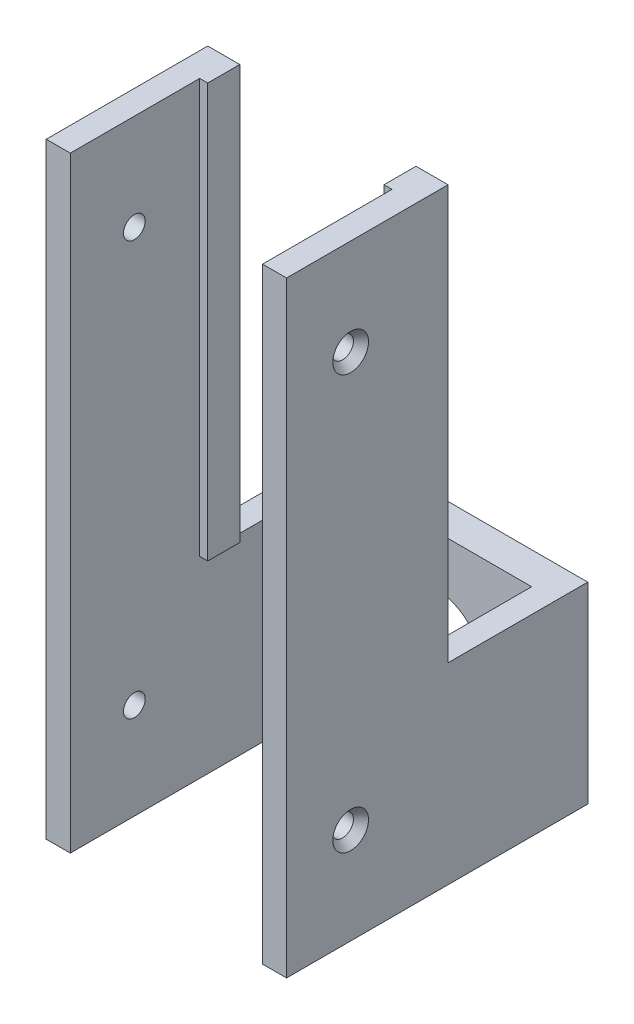
ISO-10303-21;
HEADER;
FILE_DESCRIPTION(('STEP AP214'),'2;1');
FILE_NAME('part.step','',(''),(''),'','','');
FILE_SCHEMA(('AUTOMOTIVE_DESIGN { 1 0 10303 214 1 1 1 1 }'));
ENDSEC;
DATA;
#1=APPLICATION_CONTEXT('core data for automotive mechanical design processes');
#2=APPLICATION_PROTOCOL_DEFINITION('international standard','automotive_design',2000,#1);
#3=PRODUCT_CONTEXT('',#1,'mechanical');
#4=PRODUCT('Part','Part','',(#3));
#5=PRODUCT_RELATED_PRODUCT_CATEGORY('part','',(#4));
#6=PRODUCT_DEFINITION_FORMATION('','',#4);
#7=PRODUCT_DEFINITION_CONTEXT('part definition',#1,'design');
#8=PRODUCT_DEFINITION('design','',#6,#7);
#9=PRODUCT_DEFINITION_SHAPE('','',#8);
#10=(LENGTH_UNIT() NAMED_UNIT(*) SI_UNIT(.MILLI.,.METRE.));
#11=(NAMED_UNIT(*) PLANE_ANGLE_UNIT() SI_UNIT($,.RADIAN.));
#12=(NAMED_UNIT(*) SI_UNIT($,.STERADIAN.) SOLID_ANGLE_UNIT());
#13=UNCERTAINTY_MEASURE_WITH_UNIT(LENGTH_MEASURE(1.E-05),#10,'distance_accuracy_value','');
#14=(GEOMETRIC_REPRESENTATION_CONTEXT(3) GLOBAL_UNCERTAINTY_ASSIGNED_CONTEXT((#13)) GLOBAL_UNIT_ASSIGNED_CONTEXT((#10,
#11,#12)) REPRESENTATION_CONTEXT('',''));
#15=CARTESIAN_POINT('',(0.,0.,0.));
#16=DIRECTION('',(0.,0.,1.));
#17=DIRECTION('',(1.,0.,0.));
#18=AXIS2_PLACEMENT_3D('',#15,#16,#17);
#19=CARTESIAN_POINT('',(0.,38.1,0.));
#20=DIRECTION('',(0.,-1.,0.));
#21=DIRECTION('',(0.,0.,-1.));
#22=AXIS2_PLACEMENT_3D('',#19,#20,#21);
#23=PLANE('',#22);
#24=DIRECTION('',(0.,0.,1.));
#25=VECTOR('',#24,1.);
#26=CARTESIAN_POINT('',(42.8625,38.1,0.));
#27=LINE('',#26,#25);
#28=CARTESIAN_POINT('',(42.8625,38.1,-53.34));
#29=VERTEX_POINT('',#28);
#30=CARTESIAN_POINT('',(42.8625,38.1,-32.004));
#31=VERTEX_POINT('',#30);
#32=EDGE_CURVE('E346',#29,#31,#27,.T.);
#33=ORIENTED_EDGE('',*,*,#32,.T.);
#34=DIRECTION('',(-1.,0.,0.));
#35=VECTOR('',#34,1.);
#36=CARTESIAN_POINT('',(47.625,38.1,-32.004));
#37=LINE('',#36,#35);
#38=CARTESIAN_POINT('',(47.625,38.1,-32.004));
#39=VERTEX_POINT('',#38);
#40=EDGE_CURVE('E205',#39,#31,#37,.T.);
#41=ORIENTED_EDGE('',*,*,#40,.F.);
#42=DIRECTION('',(0.,0.,-1.));
#43=VECTOR('',#42,1.);
#44=CARTESIAN_POINT('',(47.625,38.1,-59.69));
#45=LINE('',#44,#43);
#46=CARTESIAN_POINT('',(47.625,38.1,-59.69));
#47=VERTEX_POINT('',#46);
#48=EDGE_CURVE('E350',#39,#47,#45,.T.);
#49=ORIENTED_EDGE('',*,*,#48,.T.);
#50=DIRECTION('',(-1.,0.,0.));
#51=VECTOR('',#50,1.);
#52=CARTESIAN_POINT('',(0.,38.1,-59.69));
#53=LINE('',#52,#51);
#54=CARTESIAN_POINT('',(0.,38.1,-59.69));
#55=VERTEX_POINT('',#54);
#56=EDGE_CURVE('E61',#47,#55,#53,.T.);
#57=ORIENTED_EDGE('',*,*,#56,.T.);
#58=DIRECTION('',(0.,0.,1.));
#59=VECTOR('',#58,1.);
#60=CARTESIAN_POINT('',(0.,38.1,0.));
#61=LINE('',#60,#59);
#62=CARTESIAN_POINT('',(0.,38.1,-32.004));
#63=VERTEX_POINT('',#62);
#64=EDGE_CURVE('E355',#55,#63,#61,.T.);
#65=ORIENTED_EDGE('',*,*,#64,.T.);
#66=DIRECTION('',(-1.,0.,0.));
#67=VECTOR('',#66,1.);
#68=CARTESIAN_POINT('',(0.,38.1,-32.004));
#69=LINE('',#68,#67);
#70=CARTESIAN_POINT('',(4.7625,38.1,-32.004));
#71=VERTEX_POINT('',#70);
#72=EDGE_CURVE('E235',#71,#63,#69,.T.);
#73=ORIENTED_EDGE('',*,*,#72,.F.);
#74=DIRECTION('',(0.,0.,-1.));
#75=VECTOR('',#74,1.);
#76=CARTESIAN_POINT('',(4.76249999999999,38.1,-53.34));
#77=LINE('',#76,#75);
#78=CARTESIAN_POINT('',(4.76249999999999,38.1,-53.34));
#79=VERTEX_POINT('',#78);
#80=EDGE_CURVE('E104',#71,#79,#77,.T.);
#81=ORIENTED_EDGE('',*,*,#80,.T.);
#82=DIRECTION('',(1.,0.,0.));
#83=VECTOR('',#82,1.);
#84=CARTESIAN_POINT('',(42.8625,38.1,-53.34));
#85=LINE('',#84,#83);
#86=EDGE_CURVE('E343',#79,#29,#85,.T.);
#87=ORIENTED_EDGE('',*,*,#86,.T.);
#88=EDGE_LOOP('',(#33,#41,#49,#57,#65,#73,#81,#87));
#89=FACE_BOUND('',#88,.T.);
#90=ADVANCED_FACE('F43',(#89),#23,.F.);
#91=CARTESIAN_POINT('',(0.,38.1,0.));
#92=DIRECTION('',(1.,0.,0.));
#93=DIRECTION('',(0.,0.,-1.));
#94=AXIS2_PLACEMENT_3D('',#91,#92,#93);
#95=PLANE('',#94);
#96=DIRECTION('',(0.,0.,1.));
#97=VECTOR('',#96,1.);
#98=CARTESIAN_POINT('',(0.,0.,0.));
#99=LINE('',#98,#97);
#100=CARTESIAN_POINT('',(0.,0.,-59.69));
#101=VERTEX_POINT('',#100);
#102=CARTESIAN_POINT('',(0.,0.,0.));
#103=VERTEX_POINT('',#102);
#104=EDGE_CURVE('E97',#101,#103,#99,.T.);
#105=ORIENTED_EDGE('',*,*,#104,.T.);
#106=DIRECTION('',(0.,-1.,0.));
#107=VECTOR('',#106,1.);
#108=CARTESIAN_POINT('',(0.,38.1,0.));
#109=LINE('',#108,#107);
#110=CARTESIAN_POINT('',(0.,120.142,0.));
#111=VERTEX_POINT('',#110);
#112=EDGE_CURVE('E358',#111,#103,#109,.T.);
#113=ORIENTED_EDGE('',*,*,#112,.F.);
#114=DIRECTION('',(0.,0.,1.));
#115=VECTOR('',#114,1.);
#116=CARTESIAN_POINT('',(0.,120.142,-25.654));
#117=LINE('',#116,#115);
#118=CARTESIAN_POINT('',(0.,120.142,-32.004));
#119=VERTEX_POINT('',#118);
#120=EDGE_CURVE('E316',#119,#111,#117,.T.);
#121=ORIENTED_EDGE('',*,*,#120,.F.);
#122=DIRECTION('',(0.,1.,0.));
#123=VECTOR('',#122,1.);
#124=CARTESIAN_POINT('',(0.,120.142,-32.004));
#125=LINE('',#124,#123);
#126=EDGE_CURVE('E224',#63,#119,#125,.T.);
#127=ORIENTED_EDGE('',*,*,#126,.F.);
#128=ORIENTED_EDGE('',*,*,#64,.F.);
#129=DIRECTION('',(0.,-1.,0.));
#130=VECTOR('',#129,1.);
#131=CARTESIAN_POINT('',(0.,38.1,-59.69));
#132=LINE('',#131,#130);
#133=EDGE_CURVE('E383',#55,#101,#132,.T.);
#134=ORIENTED_EDGE('',*,*,#133,.T.);
#135=EDGE_LOOP('',(#105,#113,#121,#127,#128,#134));
#136=FACE_BOUND('',#135,.T.);
#137=CARTESIAN_POINT('',(0.,101.092,-12.7));
#138=DIRECTION('',(-1.,0.,0.));
#139=DIRECTION('',(0.,0.,1.));
#140=AXIS2_PLACEMENT_3D('',#137,#138,#139);
#141=CIRCLE('',#140,3.5433);
#142=CARTESIAN_POINT('',(0.,101.092,-9.1567));
#143=VERTEX_POINT('',#142);
#144=EDGE_CURVE('E292',#143,#143,#141,.T.);
#145=ORIENTED_EDGE('',*,*,#144,.F.);
#146=EDGE_LOOP('',(#145));
#147=FACE_BOUND('',#146,.T.);
#148=CARTESIAN_POINT('',(0.,19.05,-12.7));
#149=DIRECTION('',(-1.,0.,0.));
#150=DIRECTION('',(0.,0.,1.));
#151=AXIS2_PLACEMENT_3D('',#148,#149,#150);
#152=CIRCLE('',#151,3.5433);
#153=CARTESIAN_POINT('',(0.,19.05,-9.1567));
#154=VERTEX_POINT('',#153);
#155=EDGE_CURVE('E280',#154,#154,#152,.T.);
#156=ORIENTED_EDGE('',*,*,#155,.F.);
#157=EDGE_LOOP('',(#156));
#158=FACE_BOUND('',#157,.T.);
#159=ADVANCED_FACE('F434',(#136,#147,#158),#95,.F.);
#160=CARTESIAN_POINT('',(4.7625,38.1,0.));
#161=DIRECTION('',(0.,0.,-1.));
#162=DIRECTION('',(-1.,0.,0.));
#163=AXIS2_PLACEMENT_3D('',#160,#161,#162);
#164=PLANE('',#163);
#165=DIRECTION('',(1.,0.,0.));
#166=VECTOR('',#165,1.);
#167=CARTESIAN_POINT('',(4.7625,0.,0.));
#168=LINE('',#167,#166);
#169=CARTESIAN_POINT('',(4.7625,0.,0.));
#170=VERTEX_POINT('',#169);
#171=EDGE_CURVE('E339',#103,#170,#168,.T.);
#172=ORIENTED_EDGE('',*,*,#171,.T.);
#173=DIRECTION('',(0.,-1.,0.));
#174=VECTOR('',#173,1.);
#175=CARTESIAN_POINT('',(4.7625,38.1,0.));
#176=LINE('',#175,#174);
#177=CARTESIAN_POINT('',(4.7625,120.142,0.));
#178=VERTEX_POINT('',#177);
#179=EDGE_CURVE('E11',#178,#170,#176,.T.);
#180=ORIENTED_EDGE('',*,*,#179,.F.);
#181=DIRECTION('',(1.,0.,0.));
#182=VECTOR('',#181,1.);
#183=CARTESIAN_POINT('',(0.,120.142,0.));
#184=LINE('',#183,#182);
#185=EDGE_CURVE('E320',#111,#178,#184,.T.);
#186=ORIENTED_EDGE('',*,*,#185,.F.);
#187=ORIENTED_EDGE('',*,*,#112,.T.);
#188=EDGE_LOOP('',(#172,#180,#186,#187));
#189=FACE_BOUND('',#188,.T.);
#190=ADVANCED_FACE('F45',(#189),#164,.F.);
#191=CARTESIAN_POINT('',(4.76249999999999,38.1,-53.34));
#192=DIRECTION('',(-1.,0.,0.));
#193=DIRECTION('',(0.,0.,1.));
#194=AXIS2_PLACEMENT_3D('',#191,#192,#193);
#195=PLANE('',#194);
#196=CARTESIAN_POINT('',(4.7625,19.05,-12.7));
#197=DIRECTION('',(-1.,0.,0.));
#198=DIRECTION('',(0.,0.,1.));
#199=AXIS2_PLACEMENT_3D('',#196,#197,#198);
#200=CIRCLE('',#199,2.15265);
#201=CARTESIAN_POINT('',(4.7625,19.05,-10.54735));
#202=VERTEX_POINT('',#201);
#203=EDGE_CURVE('E288',#202,#202,#200,.T.);
#204=ORIENTED_EDGE('',*,*,#203,.T.);
#205=EDGE_LOOP('',(#204));
#206=FACE_BOUND('',#205,.T.);
#207=CARTESIAN_POINT('',(4.7625,101.092,-12.7));
#208=DIRECTION('',(-1.,0.,0.));
#209=DIRECTION('',(0.,0.,1.));
#210=AXIS2_PLACEMENT_3D('',#207,#208,#209);
#211=CIRCLE('',#210,2.15264999999999);
#212=CARTESIAN_POINT('',(4.7625,101.092,-10.54735));
#213=VERTEX_POINT('',#212);
#214=EDGE_CURVE('E300',#213,#213,#211,.T.);
#215=ORIENTED_EDGE('',*,*,#214,.T.);
#216=EDGE_LOOP('',(#215));
#217=FACE_BOUND('',#216,.T.);
#218=DIRECTION('',(0.,0.,-1.));
#219=VECTOR('',#218,1.);
#220=CARTESIAN_POINT('',(4.76249999999999,0.,-53.34));
#221=LINE('',#220,#219);
#222=CARTESIAN_POINT('',(4.76249999999999,0.,-53.34));
#223=VERTEX_POINT('',#222);
#224=EDGE_CURVE('E362',#170,#223,#221,.T.);
#225=ORIENTED_EDGE('',*,*,#224,.T.);
#226=DIRECTION('',(0.,-1.,0.));
#227=VECTOR('',#226,1.);
#228=CARTESIAN_POINT('',(4.76249999999999,38.1,-53.34));
#229=LINE('',#228,#227);
#230=EDGE_CURVE('E53',#79,#223,#229,.T.);
#231=ORIENTED_EDGE('',*,*,#230,.F.);
#232=ORIENTED_EDGE('',*,*,#80,.F.);
#233=CARTESIAN_POINT('',(4.7625,38.1,-25.654));
#234=VERTEX_POINT('',#233);
#235=EDGE_CURVE('E340',#234,#71,#77,.T.);
#236=ORIENTED_EDGE('',*,*,#235,.F.);
#237=DIRECTION('',(0.,-1.,0.));
#238=VECTOR('',#237,1.);
#239=CARTESIAN_POINT('',(4.7625,120.142,-25.654));
#240=LINE('',#239,#238);
#241=CARTESIAN_POINT('',(4.7625,120.142,-25.654));
#242=VERTEX_POINT('',#241);
#243=EDGE_CURVE('E328',#242,#234,#240,.T.);
#244=ORIENTED_EDGE('',*,*,#243,.F.);
#245=DIRECTION('',(0.,0.,-1.));
#246=VECTOR('',#245,1.);
#247=CARTESIAN_POINT('',(4.7625,120.142,-25.654));
#248=LINE('',#247,#246);
#249=EDGE_CURVE('E324',#178,#242,#248,.T.);
#250=ORIENTED_EDGE('',*,*,#249,.F.);
#251=ORIENTED_EDGE('',*,*,#179,.T.);
#252=EDGE_LOOP('',(#225,#231,#232,#236,#244,#250,#251));
#253=FACE_BOUND('',#252,.T.);
#254=ADVANCED_FACE('F439',(#206,#217,#253),#195,.F.);
#255=CARTESIAN_POINT('',(42.8625,38.1,-53.34));
#256=DIRECTION('',(0.,0.,-1.));
#257=DIRECTION('',(-1.,0.,0.));
#258=AXIS2_PLACEMENT_3D('',#255,#256,#257);
#259=PLANE('',#258);
#260=CARTESIAN_POINT('',(23.8125,19.05,-53.34));
#261=DIRECTION('',(0.,0.,-1.));
#262=DIRECTION('',(-1.,0.,0.));
#263=AXIS2_PLACEMENT_3D('',#260,#261,#262);
#264=CIRCLE('',#263,9.2075);
#265=CARTESIAN_POINT('',(14.605,19.05,-53.34));
#266=VERTEX_POINT('',#265);
#267=EDGE_CURVE('E335',#266,#266,#264,.T.);
#268=ORIENTED_EDGE('',*,*,#267,.T.);
#269=EDGE_LOOP('',(#268));
#270=FACE_BOUND('',#269,.T.);
#271=DIRECTION('',(1.,0.,0.));
#272=VECTOR('',#271,1.);
#273=CARTESIAN_POINT('',(42.8625,0.,-53.34));
#274=LINE('',#273,#272);
#275=CARTESIAN_POINT('',(42.8625,0.,-53.34));
#276=VERTEX_POINT('',#275);
#277=EDGE_CURVE('E365',#223,#276,#274,.T.);
#278=ORIENTED_EDGE('',*,*,#277,.T.);
#279=DIRECTION('',(0.,-1.,0.));
#280=VECTOR('',#279,1.);
#281=CARTESIAN_POINT('',(42.8625,38.1,-53.34));
#282=LINE('',#281,#280);
#283=EDGE_CURVE('E397',#29,#276,#282,.T.);
#284=ORIENTED_EDGE('',*,*,#283,.F.);
#285=ORIENTED_EDGE('',*,*,#86,.F.);
#286=ORIENTED_EDGE('',*,*,#230,.T.);
#287=EDGE_LOOP('',(#278,#284,#285,#286));
#288=FACE_BOUND('',#287,.T.);
#289=ADVANCED_FACE('F405',(#270,#288),#259,.F.);
#290=CARTESIAN_POINT('',(42.8625,38.1,0.));
#291=DIRECTION('',(1.,0.,0.));
#292=DIRECTION('',(0.,0.,-1.));
#293=AXIS2_PLACEMENT_3D('',#290,#291,#292);
#294=PLANE('',#293);
#295=CARTESIAN_POINT('',(42.8625,19.05,-12.7));
#296=DIRECTION('',(1.,0.,0.));
#297=DIRECTION('',(0.,0.,-1.));
#298=AXIS2_PLACEMENT_3D('',#295,#296,#297);
#299=CIRCLE('',#298,2.15264999999999);
#300=CARTESIAN_POINT('',(42.8625,19.05,-14.85265));
#301=VERTEX_POINT('',#300);
#302=EDGE_CURVE('E264',#301,#301,#299,.T.);
#303=ORIENTED_EDGE('',*,*,#302,.T.);
#304=EDGE_LOOP('',(#303));
#305=FACE_BOUND('',#304,.T.);
#306=CARTESIAN_POINT('',(42.8625,101.092,-12.7));
#307=DIRECTION('',(1.,0.,0.));
#308=DIRECTION('',(0.,0.,-1.));
#309=AXIS2_PLACEMENT_3D('',#306,#307,#308);
#310=CIRCLE('',#309,2.15264999999999);
#311=CARTESIAN_POINT('',(42.8625,101.092,-14.85265));
#312=VERTEX_POINT('',#311);
#313=EDGE_CURVE('E276',#312,#312,#310,.T.);
#314=ORIENTED_EDGE('',*,*,#313,.T.);
#315=EDGE_LOOP('',(#314));
#316=FACE_BOUND('',#315,.T.);
#317=DIRECTION('',(0.,0.,1.));
#318=VECTOR('',#317,1.);
#319=CARTESIAN_POINT('',(42.8625,0.,0.));
#320=LINE('',#319,#318);
#321=CARTESIAN_POINT('',(42.8625,0.,0.));
#322=VERTEX_POINT('',#321);
#323=EDGE_CURVE('E368',#276,#322,#320,.T.);
#324=ORIENTED_EDGE('',*,*,#323,.T.);
#325=DIRECTION('',(0.,-1.,0.));
#326=VECTOR('',#325,1.);
#327=CARTESIAN_POINT('',(42.8625,38.1,0.));
#328=LINE('',#327,#326);
#329=CARTESIAN_POINT('',(42.8625,120.142,0.));
#330=VERTEX_POINT('',#329);
#331=EDGE_CURVE('E393',#330,#322,#328,.T.);
#332=ORIENTED_EDGE('',*,*,#331,.F.);
#333=DIRECTION('',(0.,0.,1.));
#334=VECTOR('',#333,1.);
#335=CARTESIAN_POINT('',(42.8625,120.142,-25.654));
#336=LINE('',#335,#334);
#337=CARTESIAN_POINT('',(42.8625,120.142,-25.654));
#338=VERTEX_POINT('',#337);
#339=EDGE_CURVE('E313',#338,#330,#336,.T.);
#340=ORIENTED_EDGE('',*,*,#339,.F.);
#341=DIRECTION('',(0.,-1.,0.));
#342=VECTOR('',#341,1.);
#343=CARTESIAN_POINT('',(42.8625,120.142,-25.654));
#344=LINE('',#343,#342);
#345=CARTESIAN_POINT('',(42.8625,38.1,-25.654));
#346=VERTEX_POINT('',#345);
#347=EDGE_CURVE('E199',#338,#346,#344,.T.);
#348=ORIENTED_EDGE('',*,*,#347,.T.);
#349=DIRECTION('',(0.,0.,1.));
#350=VECTOR('',#349,1.);
#351=CARTESIAN_POINT('',(42.8625,38.1,0.));
#352=LINE('',#351,#350);
#353=EDGE_CURVE('E211',#31,#346,#352,.T.);
#354=ORIENTED_EDGE('',*,*,#353,.F.);
#355=ORIENTED_EDGE('',*,*,#32,.F.);
#356=ORIENTED_EDGE('',*,*,#283,.T.);
#357=EDGE_LOOP('',(#324,#332,#340,#348,#354,#355,#356));
#358=FACE_BOUND('',#357,.T.);
#359=ADVANCED_FACE('F415',(#305,#316,#358),#294,.F.);
#360=CARTESIAN_POINT('',(47.625,38.1,0.));
#361=DIRECTION('',(0.,0.,-1.));
#362=DIRECTION('',(-1.,0.,0.));
#363=AXIS2_PLACEMENT_3D('',#360,#361,#362);
#364=PLANE('',#363);
#365=DIRECTION('',(1.,0.,0.));
#366=VECTOR('',#365,1.);
#367=CARTESIAN_POINT('',(47.625,0.,0.));
#368=LINE('',#367,#366);
#369=CARTESIAN_POINT('',(47.625,0.,0.));
#370=VERTEX_POINT('',#369);
#371=EDGE_CURVE('E371',#322,#370,#368,.T.);
#372=ORIENTED_EDGE('',*,*,#371,.T.);
#373=DIRECTION('',(0.,-1.,0.));
#374=VECTOR('',#373,1.);
#375=CARTESIAN_POINT('',(47.625,38.1,0.));
#376=LINE('',#375,#374);
#377=CARTESIAN_POINT('',(47.625,120.142,0.));
#378=VERTEX_POINT('',#377);
#379=EDGE_CURVE('E389',#378,#370,#376,.T.);
#380=ORIENTED_EDGE('',*,*,#379,.F.);
#381=DIRECTION('',(1.,0.,0.));
#382=VECTOR('',#381,1.);
#383=CARTESIAN_POINT('',(42.8625,120.142,0.));
#384=LINE('',#383,#382);
#385=EDGE_CURVE('E309',#330,#378,#384,.T.);
#386=ORIENTED_EDGE('',*,*,#385,.F.);
#387=ORIENTED_EDGE('',*,*,#331,.T.);
#388=EDGE_LOOP('',(#372,#380,#386,#387));
#389=FACE_BOUND('',#388,.T.);
#390=ADVANCED_FACE('F419',(#389),#364,.F.);
#391=CARTESIAN_POINT('',(47.625,38.1,-59.69));
#392=DIRECTION('',(-1.,0.,0.));
#393=DIRECTION('',(0.,0.,1.));
#394=AXIS2_PLACEMENT_3D('',#391,#392,#393);
#395=PLANE('',#394);
#396=ORIENTED_EDGE('',*,*,#48,.F.);
#397=DIRECTION('',(0.,-1.,0.));
#398=VECTOR('',#397,1.);
#399=CARTESIAN_POINT('',(47.625,120.142,-32.004));
#400=LINE('',#399,#398);
#401=CARTESIAN_POINT('',(47.625,120.142,-32.004));
#402=VERTEX_POINT('',#401);
#403=EDGE_CURVE('E202',#402,#39,#400,.T.);
#404=ORIENTED_EDGE('',*,*,#403,.F.);
#405=DIRECTION('',(0.,0.,-1.));
#406=VECTOR('',#405,1.);
#407=CARTESIAN_POINT('',(47.625,120.142,-25.654));
#408=LINE('',#407,#406);
#409=EDGE_CURVE('E306',#378,#402,#408,.T.);
#410=ORIENTED_EDGE('',*,*,#409,.F.);
#411=ORIENTED_EDGE('',*,*,#379,.T.);
#412=DIRECTION('',(0.,0.,-1.));
#413=VECTOR('',#412,1.);
#414=CARTESIAN_POINT('',(47.625,0.,-59.69));
#415=LINE('',#414,#413);
#416=CARTESIAN_POINT('',(47.625,0.,-59.69));
#417=VERTEX_POINT('',#416);
#418=EDGE_CURVE('E374',#370,#417,#415,.T.);
#419=ORIENTED_EDGE('',*,*,#418,.T.);
#420=DIRECTION('',(0.,-1.,0.));
#421=VECTOR('',#420,1.);
#422=CARTESIAN_POINT('',(47.625,38.1,-59.69));
#423=LINE('',#422,#421);
#424=EDGE_CURVE('E386',#47,#417,#423,.T.);
#425=ORIENTED_EDGE('',*,*,#424,.F.);
#426=EDGE_LOOP('',(#396,#404,#410,#411,#419,#425));
#427=FACE_BOUND('',#426,.T.);
#428=CARTESIAN_POINT('',(47.625,19.05,-12.7));
#429=DIRECTION('',(1.,0.,0.));
#430=DIRECTION('',(0.,0.,-1.));
#431=AXIS2_PLACEMENT_3D('',#428,#429,#430);
#432=CIRCLE('',#431,3.5433);
#433=CARTESIAN_POINT('',(47.625,19.05,-16.2433));
#434=VERTEX_POINT('',#433);
#435=EDGE_CURVE('E256',#434,#434,#432,.T.);
#436=ORIENTED_EDGE('',*,*,#435,.F.);
#437=EDGE_LOOP('',(#436));
#438=FACE_BOUND('',#437,.T.);
#439=CARTESIAN_POINT('',(47.625,101.092,-12.7));
#440=DIRECTION('',(1.,0.,0.));
#441=DIRECTION('',(0.,0.,-1.));
#442=AXIS2_PLACEMENT_3D('',#439,#440,#441);
#443=CIRCLE('',#442,3.5433);
#444=CARTESIAN_POINT('',(47.625,101.092,-16.2433));
#445=VERTEX_POINT('',#444);
#446=EDGE_CURVE('E268',#445,#445,#443,.T.);
#447=ORIENTED_EDGE('',*,*,#446,.F.);
#448=EDGE_LOOP('',(#447));
#449=FACE_BOUND('',#448,.T.);
#450=ADVANCED_FACE('F429',(#427,#438,#449),#395,.F.);
#451=CARTESIAN_POINT('',(0.,38.1,-59.69));
#452=DIRECTION('',(0.,0.,1.));
#453=DIRECTION('',(1.,0.,0.));
#454=AXIS2_PLACEMENT_3D('',#451,#452,#453);
#455=PLANE('',#454);
#456=CARTESIAN_POINT('',(23.8125,19.05,-59.69));
#457=DIRECTION('',(0.,0.,-1.));
#458=DIRECTION('',(-1.,0.,0.));
#459=AXIS2_PLACEMENT_3D('',#456,#457,#458);
#460=CIRCLE('',#459,9.2075);
#461=CARTESIAN_POINT('',(14.605,19.05,-59.69));
#462=VERTEX_POINT('',#461);
#463=EDGE_CURVE('E331',#462,#462,#460,.T.);
#464=ORIENTED_EDGE('',*,*,#463,.F.);
#465=EDGE_LOOP('',(#464));
#466=FACE_BOUND('',#465,.T.);
#467=DIRECTION('',(-1.,0.,0.));
#468=VECTOR('',#467,1.);
#469=CARTESIAN_POINT('',(0.,0.,-59.69));
#470=LINE('',#469,#468);
#471=EDGE_CURVE('E90',#417,#101,#470,.T.);
#472=ORIENTED_EDGE('',*,*,#471,.T.);
#473=ORIENTED_EDGE('',*,*,#133,.F.);
#474=ORIENTED_EDGE('',*,*,#56,.F.);
#475=ORIENTED_EDGE('',*,*,#424,.T.);
#476=EDGE_LOOP('',(#472,#473,#474,#475));
#477=FACE_BOUND('',#476,.T.);
#478=ADVANCED_FACE('F431',(#466,#477),#455,.F.);
#479=CARTESIAN_POINT('',(0.,0.,0.));
#480=DIRECTION('',(0.,-1.,0.));
#481=DIRECTION('',(0.,0.,-1.));
#482=AXIS2_PLACEMENT_3D('',#479,#480,#481);
#483=PLANE('',#482);
#484=ORIENTED_EDGE('',*,*,#171,.F.);
#485=ORIENTED_EDGE('',*,*,#104,.F.);
#486=ORIENTED_EDGE('',*,*,#471,.F.);
#487=ORIENTED_EDGE('',*,*,#418,.F.);
#488=ORIENTED_EDGE('',*,*,#371,.F.);
#489=ORIENTED_EDGE('',*,*,#323,.F.);
#490=ORIENTED_EDGE('',*,*,#277,.F.);
#491=ORIENTED_EDGE('',*,*,#224,.F.);
#492=EDGE_LOOP('',(#484,#485,#486,#487,#488,#489,#490,#491));
#493=FACE_BOUND('',#492,.T.);
#494=ADVANCED_FACE('F411',(#493),#483,.T.);
#495=CARTESIAN_POINT('',(23.8125,19.05,-21.59));
#496=DIRECTION('',(0.,0.,-1.));
#497=DIRECTION('',(-1.,0.,0.));
#498=AXIS2_PLACEMENT_3D('',#495,#496,#497);
#499=CYLINDRICAL_SURFACE('',#498,9.2075);
#500=CARTESIAN_POINT('',(14.605,19.05,-59.69));
#501=CARTESIAN_POINT('',(14.605,19.05,-59.6238541666667));
#502=CARTESIAN_POINT('',(14.605,19.05,-59.5577083333333));
#503=CARTESIAN_POINT('',(14.605,19.05,-59.4254166666667));
#504=CARTESIAN_POINT('',(14.605,19.05,-59.3592708333333));
#505=CARTESIAN_POINT('',(14.605,19.05,-59.2269791666667));
#506=CARTESIAN_POINT('',(14.605,19.05,-59.1608333333333));
#507=CARTESIAN_POINT('',(14.605,19.05,-59.0285416666667));
#508=CARTESIAN_POINT('',(14.605,19.05,-58.9623958333333));
#509=CARTESIAN_POINT('',(14.605,19.05,-58.8301041666667));
#510=CARTESIAN_POINT('',(14.605,19.05,-58.7639583333333));
#511=CARTESIAN_POINT('',(14.605,19.05,-58.6316666666667));
#512=CARTESIAN_POINT('',(14.605,19.05,-58.5655208333333));
#513=CARTESIAN_POINT('',(14.605,19.05,-58.4332291666667));
#514=CARTESIAN_POINT('',(14.605,19.05,-58.3670833333333));
#515=CARTESIAN_POINT('',(14.605,19.05,-58.2347916666667));
#516=CARTESIAN_POINT('',(14.605,19.05,-58.1686458333333));
#517=CARTESIAN_POINT('',(14.605,19.05,-58.0363541666667));
#518=CARTESIAN_POINT('',(14.605,19.05,-57.9702083333333));
#519=CARTESIAN_POINT('',(14.605,19.05,-57.8379166666667));
#520=CARTESIAN_POINT('',(14.605,19.05,-57.7717708333333));
#521=CARTESIAN_POINT('',(14.605,19.05,-57.6394791666667));
#522=CARTESIAN_POINT('',(14.605,19.05,-57.5733333333333));
#523=CARTESIAN_POINT('',(14.605,19.05,-57.4410416666667));
#524=CARTESIAN_POINT('',(14.605,19.05,-57.3748958333333));
#525=CARTESIAN_POINT('',(14.605,19.05,-57.2426041666667));
#526=CARTESIAN_POINT('',(14.605,19.05,-57.1764583333333));
#527=CARTESIAN_POINT('',(14.605,19.05,-57.0441666666667));
#528=CARTESIAN_POINT('',(14.605,19.05,-56.9780208333333));
#529=CARTESIAN_POINT('',(14.605,19.05,-56.8457291666667));
#530=CARTESIAN_POINT('',(14.605,19.05,-56.7795833333333));
#531=CARTESIAN_POINT('',(14.605,19.05,-56.6472916666667));
#532=CARTESIAN_POINT('',(14.605,19.05,-56.5811458333333));
#533=CARTESIAN_POINT('',(14.605,19.05,-56.4488541666667));
#534=CARTESIAN_POINT('',(14.605,19.05,-56.3827083333333));
#535=CARTESIAN_POINT('',(14.605,19.05,-56.2504166666667));
#536=CARTESIAN_POINT('',(14.605,19.05,-56.1842708333333));
#537=CARTESIAN_POINT('',(14.605,19.05,-56.0519791666667));
#538=CARTESIAN_POINT('',(14.605,19.05,-55.9858333333333));
#539=CARTESIAN_POINT('',(14.605,19.05,-55.8535416666667));
#540=CARTESIAN_POINT('',(14.605,19.05,-55.7873958333333));
#541=CARTESIAN_POINT('',(14.605,19.05,-55.6551041666667));
#542=CARTESIAN_POINT('',(14.605,19.05,-55.5889583333333));
#543=CARTESIAN_POINT('',(14.605,19.05,-55.4566666666667));
#544=CARTESIAN_POINT('',(14.605,19.05,-55.3905208333333));
#545=CARTESIAN_POINT('',(14.605,19.05,-55.2582291666667));
#546=CARTESIAN_POINT('',(14.605,19.05,-55.1920833333333));
#547=CARTESIAN_POINT('',(14.605,19.05,-55.0597916666667));
#548=CARTESIAN_POINT('',(14.605,19.05,-54.9936458333333));
#549=CARTESIAN_POINT('',(14.605,19.05,-54.8613541666667));
#550=CARTESIAN_POINT('',(14.605,19.05,-54.7952083333333));
#551=CARTESIAN_POINT('',(14.605,19.05,-54.6629166666667));
#552=CARTESIAN_POINT('',(14.605,19.05,-54.5967708333333));
#553=CARTESIAN_POINT('',(14.605,19.05,-54.4644791666667));
#554=CARTESIAN_POINT('',(14.605,19.05,-54.3983333333333));
#555=CARTESIAN_POINT('',(14.605,19.05,-54.2660416666667));
#556=CARTESIAN_POINT('',(14.605,19.05,-54.1998958333333));
#557=CARTESIAN_POINT('',(14.605,19.05,-54.0676041666667));
#558=CARTESIAN_POINT('',(14.605,19.05,-54.0014583333333));
#559=CARTESIAN_POINT('',(14.605,19.05,-53.8691666666667));
#560=CARTESIAN_POINT('',(14.605,19.05,-53.8030208333333));
#561=CARTESIAN_POINT('',(14.605,19.05,-53.6707291666667));
#562=CARTESIAN_POINT('',(14.605,19.05,-53.6045833333333));
#563=CARTESIAN_POINT('',(14.605,19.05,-53.4722916666667));
#564=CARTESIAN_POINT('',(14.605,19.05,-53.4061458333333));
#565=CARTESIAN_POINT('',(14.605,19.05,-53.34));
#566=B_SPLINE_CURVE_WITH_KNOTS('',3,(#500,#501,#502,#503,#504,#505,#506,#507,#508,#509,#510,
#511,#512,#513,#514,#515,#516,#517,#518,#519,#520,#521,#522,#523,#524,#525,#526,#527,#528,#529,
#530,#531,#532,#533,#534,#535,#536,#537,#538,#539,#540,#541,#542,#543,#544,#545,#546,#547,#548,
#549,#550,#551,#552,#553,#554,#555,#556,#557,#558,#559,#560,#561,#562,#563,#564,#565),
.UNSPECIFIED.,.F.,.F.,(4,2,2,2,2,2,2,2,2,2,2,2,2,2,2,2,2,2,2,2,2,2,2,2,2,2,2,2,2,2,2,2,4),(0.,
0.198437500000009,0.396875000000005,0.5953125,0.793749999999996,0.992187500000005,1.190625,
1.3890625,1.58750000000001,1.7859375,1.984375,2.18281250000001,2.38125,2.5796875,
2.77812500000001,2.9765625,3.175,3.37343750000001,3.571875,3.7703125,3.96874999999999,4.1671875,
4.365625,4.56406249999999,4.7625,4.9609375,5.15937499999999,5.3578125,5.55625,5.75468749999999,
5.953125,6.1515625,6.34999999999999),.UNSPECIFIED.);
#567=EDGE_CURVE('BSEAM474',#462,#266,#566,.T.);
#568=ORIENTED_EDGE('',*,*,#463,.T.);
#569=ORIENTED_EDGE('',*,*,#267,.F.);
#570=ORIENTED_EDGE('',*,*,#567,.T.);
#571=ORIENTED_EDGE('',*,*,#567,.F.);
#572=EDGE_LOOP('',(#568,#570,#569,#571));
#573=FACE_BOUND('',#572,.T.);
#574=ADVANCED_FACE('F474',(#573),#499,.F.);
#575=CARTESIAN_POINT('',(0.,120.142,0.));
#576=DIRECTION('',(0.,1.,0.));
#577=DIRECTION('',(0.,0.,1.));
#578=AXIS2_PLACEMENT_3D('',#575,#576,#577);
#579=PLANE('',#578);
#580=ORIENTED_EDGE('',*,*,#120,.T.);
#581=ORIENTED_EDGE('',*,*,#185,.T.);
#582=ORIENTED_EDGE('',*,*,#249,.T.);
#583=DIRECTION('',(1.,0.,0.));
#584=VECTOR('',#583,1.);
#585=CARTESIAN_POINT('',(0.,120.142,-25.654));
#586=LINE('',#585,#584);
#587=CARTESIAN_POINT('',(6.35,120.142,-25.654));
#588=VERTEX_POINT('',#587);
#589=EDGE_CURVE('E223',#242,#588,#586,.T.);
#590=ORIENTED_EDGE('',*,*,#589,.T.);
#591=DIRECTION('',(0.,0.,1.));
#592=VECTOR('',#591,1.);
#593=CARTESIAN_POINT('',(6.35,120.142,-32.004));
#594=LINE('',#593,#592);
#595=CARTESIAN_POINT('',(6.35,120.142,-32.004));
#596=VERTEX_POINT('',#595);
#597=EDGE_CURVE('E252',#596,#588,#594,.T.);
#598=ORIENTED_EDGE('',*,*,#597,.F.);
#599=DIRECTION('',(1.,0.,0.));
#600=VECTOR('',#599,1.);
#601=CARTESIAN_POINT('',(0.,120.142,-32.004));
#602=LINE('',#601,#600);
#603=EDGE_CURVE('E228',#119,#596,#602,.T.);
#604=ORIENTED_EDGE('',*,*,#603,.F.);
#605=EDGE_LOOP('',(#580,#581,#582,#590,#598,#604));
#606=FACE_BOUND('',#605,.T.);
#607=ADVANCED_FACE('F458',(#606),#579,.T.);
#608=CARTESIAN_POINT('',(0.,120.142,0.));
#609=DIRECTION('',(0.,1.,0.));
#610=DIRECTION('',(0.,0.,1.));
#611=AXIS2_PLACEMENT_3D('',#608,#609,#610);
#612=PLANE('',#611);
#613=ORIENTED_EDGE('',*,*,#339,.T.);
#614=ORIENTED_EDGE('',*,*,#385,.T.);
#615=ORIENTED_EDGE('',*,*,#409,.T.);
#616=DIRECTION('',(1.,0.,0.));
#617=VECTOR('',#616,1.);
#618=CARTESIAN_POINT('',(47.625,120.142,-32.004));
#619=LINE('',#618,#617);
#620=CARTESIAN_POINT('',(41.275,120.142,-32.004));
#621=VERTEX_POINT('',#620);
#622=EDGE_CURVE('E194',#621,#402,#619,.T.);
#623=ORIENTED_EDGE('',*,*,#622,.F.);
#624=DIRECTION('',(0.,0.,1.));
#625=VECTOR('',#624,1.);
#626=CARTESIAN_POINT('',(41.275,120.142,-32.004));
#627=LINE('',#626,#625);
#628=CARTESIAN_POINT('',(41.275,120.142,-25.654));
#629=VERTEX_POINT('',#628);
#630=EDGE_CURVE('E178',#621,#629,#627,.T.);
#631=ORIENTED_EDGE('',*,*,#630,.T.);
#632=DIRECTION('',(1.,0.,0.));
#633=VECTOR('',#632,1.);
#634=CARTESIAN_POINT('',(47.625,120.142,-25.654));
#635=LINE('',#634,#633);
#636=EDGE_CURVE('E187',#629,#338,#635,.T.);
#637=ORIENTED_EDGE('',*,*,#636,.T.);
#638=EDGE_LOOP('',(#613,#614,#615,#623,#631,#637));
#639=FACE_BOUND('',#638,.T.);
#640=ADVANCED_FACE('F191',(#639),#612,.T.);
#641=CARTESIAN_POINT('',(0.,101.092,-12.7));
#642=DIRECTION('',(-1.,0.,0.));
#643=DIRECTION('',(0.,0.,1.));
#644=AXIS2_PLACEMENT_3D('',#641,#642,#643);
#645=CYLINDRICAL_SURFACE('',#644,2.15264999999999);
#646=ORIENTED_EDGE('',*,*,#214,.F.);
#647=EDGE_LOOP('',(#646));
#648=FACE_BOUND('',#647,.T.);
#649=CARTESIAN_POINT('',(1.5997598255019,101.092,-12.7));
#650=DIRECTION('',(-1.,0.,0.));
#651=DIRECTION('',(0.,0.,1.));
#652=AXIS2_PLACEMENT_3D('',#649,#650,#651);
#653=CIRCLE('',#652,2.15264999999999);
#654=CARTESIAN_POINT('',(1.5997598255019,101.092,-10.54735));
#655=VERTEX_POINT('',#654);
#656=EDGE_CURVE('E296',#655,#655,#653,.T.);
#657=ORIENTED_EDGE('',*,*,#656,.T.);
#658=EDGE_LOOP('',(#657));
#659=FACE_BOUND('',#658,.T.);
#660=ADVANCED_FACE('F503',(#648,#659),#645,.F.);
#661=CARTESIAN_POINT('',(0.,101.092,-12.7));
#662=DIRECTION('',(-1.,0.,0.));
#663=DIRECTION('',(0.,0.,1.));
#664=AXIS2_PLACEMENT_3D('',#661,#662,#663);
#665=CONICAL_SURFACE('',#664,3.5433,0.715584993317676);
#666=ORIENTED_EDGE('',*,*,#656,.F.);
#667=EDGE_LOOP('',(#666));
#668=FACE_BOUND('',#667,.T.);
#669=ORIENTED_EDGE('',*,*,#144,.T.);
#670=EDGE_LOOP('',(#669));
#671=FACE_BOUND('',#670,.T.);
#672=ADVANCED_FACE('F508',(#668,#671),#665,.F.);
#673=CARTESIAN_POINT('',(0.,19.05,-12.7));
#674=DIRECTION('',(-1.,0.,0.));
#675=DIRECTION('',(0.,0.,1.));
#676=AXIS2_PLACEMENT_3D('',#673,#674,#675);
#677=CYLINDRICAL_SURFACE('',#676,2.15265);
#678=ORIENTED_EDGE('',*,*,#203,.F.);
#679=EDGE_LOOP('',(#678));
#680=FACE_BOUND('',#679,.T.);
#681=CARTESIAN_POINT('',(1.5997598255019,19.05,-12.7));
#682=DIRECTION('',(-1.,0.,0.));
#683=DIRECTION('',(0.,0.,1.));
#684=AXIS2_PLACEMENT_3D('',#681,#682,#683);
#685=CIRCLE('',#684,2.15265);
#686=CARTESIAN_POINT('',(1.5997598255019,19.05,-10.54735));
#687=VERTEX_POINT('',#686);
#688=EDGE_CURVE('E284',#687,#687,#685,.T.);
#689=ORIENTED_EDGE('',*,*,#688,.T.);
#690=EDGE_LOOP('',(#689));
#691=FACE_BOUND('',#690,.T.);
#692=ADVANCED_FACE('F512',(#680,#691),#677,.F.);
#693=CARTESIAN_POINT('',(0.,19.05,-12.7));
#694=DIRECTION('',(-1.,0.,0.));
#695=DIRECTION('',(0.,0.,1.));
#696=AXIS2_PLACEMENT_3D('',#693,#694,#695);
#697=CONICAL_SURFACE('',#696,3.5433,0.715584993317674);
#698=ORIENTED_EDGE('',*,*,#688,.F.);
#699=EDGE_LOOP('',(#698));
#700=FACE_BOUND('',#699,.T.);
#701=ORIENTED_EDGE('',*,*,#155,.T.);
#702=EDGE_LOOP('',(#701));
#703=FACE_BOUND('',#702,.T.);
#704=ADVANCED_FACE('F516',(#700,#703),#697,.F.);
#705=CARTESIAN_POINT('',(47.625,101.092,-12.7));
#706=DIRECTION('',(1.,0.,0.));
#707=DIRECTION('',(0.,0.,-1.));
#708=AXIS2_PLACEMENT_3D('',#705,#706,#707);
#709=CYLINDRICAL_SURFACE('',#708,2.15264999999999);
#710=ORIENTED_EDGE('',*,*,#313,.F.);
#711=EDGE_LOOP('',(#710));
#712=FACE_BOUND('',#711,.T.);
#713=CARTESIAN_POINT('',(46.0252401744981,101.092,-12.7));
#714=DIRECTION('',(1.,0.,0.));
#715=DIRECTION('',(0.,0.,-1.));
#716=AXIS2_PLACEMENT_3D('',#713,#714,#715);
#717=CIRCLE('',#716,2.15264999999999);
#718=CARTESIAN_POINT('',(46.0252401744981,101.092,-14.85265));
#719=VERTEX_POINT('',#718);
#720=EDGE_CURVE('E272',#719,#719,#717,.T.);
#721=ORIENTED_EDGE('',*,*,#720,.T.);
#722=EDGE_LOOP('',(#721));
#723=FACE_BOUND('',#722,.T.);
#724=ADVANCED_FACE('F520',(#712,#723),#709,.F.);
#725=CARTESIAN_POINT('',(47.625,101.092,-12.7));
#726=DIRECTION('',(1.,0.,0.));
#727=DIRECTION('',(0.,0.,-1.));
#728=AXIS2_PLACEMENT_3D('',#725,#726,#727);
#729=CONICAL_SURFACE('',#728,3.5433,0.715584993317674);
#730=ORIENTED_EDGE('',*,*,#720,.F.);
#731=EDGE_LOOP('',(#730));
#732=FACE_BOUND('',#731,.T.);
#733=ORIENTED_EDGE('',*,*,#446,.T.);
#734=EDGE_LOOP('',(#733));
#735=FACE_BOUND('',#734,.T.);
#736=ADVANCED_FACE('F524',(#732,#735),#729,.F.);
#737=CARTESIAN_POINT('',(47.625,19.05,-12.7));
#738=DIRECTION('',(1.,0.,0.));
#739=DIRECTION('',(0.,0.,-1.));
#740=AXIS2_PLACEMENT_3D('',#737,#738,#739);
#741=CYLINDRICAL_SURFACE('',#740,2.15264999999999);
#742=ORIENTED_EDGE('',*,*,#302,.F.);
#743=EDGE_LOOP('',(#742));
#744=FACE_BOUND('',#743,.T.);
#745=CARTESIAN_POINT('',(46.0252401744981,19.05,-12.7));
#746=DIRECTION('',(1.,0.,0.));
#747=DIRECTION('',(0.,0.,-1.));
#748=AXIS2_PLACEMENT_3D('',#745,#746,#747);
#749=CIRCLE('',#748,2.15264999999999);
#750=CARTESIAN_POINT('',(46.0252401744981,19.05,-14.85265));
#751=VERTEX_POINT('',#750);
#752=EDGE_CURVE('E260',#751,#751,#749,.T.);
#753=ORIENTED_EDGE('',*,*,#752,.T.);
#754=EDGE_LOOP('',(#753));
#755=FACE_BOUND('',#754,.T.);
#756=ADVANCED_FACE('F528',(#744,#755),#741,.F.);
#757=CARTESIAN_POINT('',(47.625,19.05,-12.7));
#758=DIRECTION('',(1.,0.,0.));
#759=DIRECTION('',(0.,0.,-1.));
#760=AXIS2_PLACEMENT_3D('',#757,#758,#759);
#761=CONICAL_SURFACE('',#760,3.5433,0.715584993317675);
#762=ORIENTED_EDGE('',*,*,#752,.F.);
#763=EDGE_LOOP('',(#762));
#764=FACE_BOUND('',#763,.T.);
#765=ORIENTED_EDGE('',*,*,#435,.T.);
#766=EDGE_LOOP('',(#765));
#767=FACE_BOUND('',#766,.T.);
#768=ADVANCED_FACE('F532',(#764,#767),#761,.F.);
#769=CARTESIAN_POINT('',(0.,38.1,-32.004));
#770=DIRECTION('',(0.,1.,0.));
#771=DIRECTION('',(0.,0.,1.));
#772=AXIS2_PLACEMENT_3D('',#769,#770,#771);
#773=PLANE('',#772);
#774=DIRECTION('',(-1.,0.,0.));
#775=VECTOR('',#774,1.);
#776=CARTESIAN_POINT('',(0.,38.1,-25.654));
#777=LINE('',#776,#775);
#778=CARTESIAN_POINT('',(6.34999999999999,38.1,-25.654));
#779=VERTEX_POINT('',#778);
#780=EDGE_CURVE('E229',#779,#234,#777,.T.);
#781=ORIENTED_EDGE('',*,*,#780,.T.);
#782=ORIENTED_EDGE('',*,*,#235,.T.);
#783=CARTESIAN_POINT('',(6.34999999999999,38.1,-32.004));
#784=VERTEX_POINT('',#783);
#785=EDGE_CURVE('E236',#784,#71,#69,.T.);
#786=ORIENTED_EDGE('',*,*,#785,.F.);
#787=DIRECTION('',(0.,0.,1.));
#788=VECTOR('',#787,1.);
#789=CARTESIAN_POINT('',(6.34999999999999,38.1,-32.004));
#790=LINE('',#789,#788);
#791=EDGE_CURVE('E240',#784,#779,#790,.T.);
#792=ORIENTED_EDGE('',*,*,#791,.T.);
#793=EDGE_LOOP('',(#781,#782,#786,#792));
#794=FACE_BOUND('',#793,.T.);
#795=ADVANCED_FACE('F445',(#794),#773,.F.);
#796=CARTESIAN_POINT('',(0.,0.,-25.654));
#797=DIRECTION('',(0.,0.,1.));
#798=DIRECTION('',(1.,0.,0.));
#799=AXIS2_PLACEMENT_3D('',#796,#797,#798);
#800=PLANE('',#799);
#801=ORIENTED_EDGE('',*,*,#243,.T.);
#802=ORIENTED_EDGE('',*,*,#780,.F.);
#803=DIRECTION('',(0.,-1.,0.));
#804=VECTOR('',#803,1.);
#805=CARTESIAN_POINT('',(6.35,120.142,-25.654));
#806=LINE('',#805,#804);
#807=EDGE_CURVE('E243',#588,#779,#806,.T.);
#808=ORIENTED_EDGE('',*,*,#807,.F.);
#809=ORIENTED_EDGE('',*,*,#589,.F.);
#810=EDGE_LOOP('',(#801,#802,#808,#809));
#811=FACE_BOUND('',#810,.T.);
#812=ADVANCED_FACE('F456',(#811),#800,.T.);
#813=CARTESIAN_POINT('',(6.35,120.142,-32.004));
#814=DIRECTION('',(-1.,0.,0.));
#815=DIRECTION('',(0.,-1.,0.));
#816=AXIS2_PLACEMENT_3D('',#813,#814,#815);
#817=PLANE('',#816);
#818=ORIENTED_EDGE('',*,*,#807,.T.);
#819=ORIENTED_EDGE('',*,*,#791,.F.);
#820=DIRECTION('',(0.,-1.,0.));
#821=VECTOR('',#820,1.);
#822=CARTESIAN_POINT('',(6.35,120.142,-32.004));
#823=LINE('',#822,#821);
#824=EDGE_CURVE('E232',#596,#784,#823,.T.);
#825=ORIENTED_EDGE('',*,*,#824,.F.);
#826=ORIENTED_EDGE('',*,*,#597,.T.);
#827=EDGE_LOOP('',(#818,#819,#825,#826));
#828=FACE_BOUND('',#827,.T.);
#829=ADVANCED_FACE('F453',(#828),#817,.F.);
#830=CARTESIAN_POINT('',(0.,0.,-32.004));
#831=DIRECTION('',(0.,0.,1.));
#832=DIRECTION('',(1.,0.,0.));
#833=AXIS2_PLACEMENT_3D('',#830,#831,#832);
#834=PLANE('',#833);
#835=ORIENTED_EDGE('',*,*,#126,.T.);
#836=ORIENTED_EDGE('',*,*,#603,.T.);
#837=ORIENTED_EDGE('',*,*,#824,.T.);
#838=ORIENTED_EDGE('',*,*,#785,.T.);
#839=ORIENTED_EDGE('',*,*,#72,.T.);
#840=EDGE_LOOP('',(#835,#836,#837,#838,#839));
#841=FACE_BOUND('',#840,.T.);
#842=ADVANCED_FACE('F447',(#841),#834,.F.);
#843=CARTESIAN_POINT('',(47.625,38.1,-32.004));
#844=DIRECTION('',(0.,1.,0.));
#845=DIRECTION('',(0.,0.,1.));
#846=AXIS2_PLACEMENT_3D('',#843,#844,#845);
#847=PLANE('',#846);
#848=CARTESIAN_POINT('',(41.275,38.1,-32.004));
#849=VERTEX_POINT('',#848);
#850=EDGE_CURVE('E217',#31,#849,#37,.T.);
#851=ORIENTED_EDGE('',*,*,#850,.F.);
#852=ORIENTED_EDGE('',*,*,#353,.T.);
#853=DIRECTION('',(-1.,0.,0.));
#854=VECTOR('',#853,1.);
#855=CARTESIAN_POINT('',(47.625,38.1,-25.654));
#856=LINE('',#855,#854);
#857=CARTESIAN_POINT('',(41.275,38.1,-25.654));
#858=VERTEX_POINT('',#857);
#859=EDGE_CURVE('E186',#346,#858,#856,.T.);
#860=ORIENTED_EDGE('',*,*,#859,.T.);
#861=DIRECTION('',(0.,0.,1.));
#862=VECTOR('',#861,1.);
#863=CARTESIAN_POINT('',(41.275,38.1,-32.004));
#864=LINE('',#863,#862);
#865=EDGE_CURVE('E181',#849,#858,#864,.T.);
#866=ORIENTED_EDGE('',*,*,#865,.F.);
#867=EDGE_LOOP('',(#851,#852,#860,#866));
#868=FACE_BOUND('',#867,.T.);
#869=ADVANCED_FACE('F545',(#868),#847,.F.);
#870=CARTESIAN_POINT('',(0.,0.,-25.654));
#871=DIRECTION('',(0.,0.,-1.));
#872=DIRECTION('',(-1.,0.,0.));
#873=AXIS2_PLACEMENT_3D('',#870,#871,#872);
#874=PLANE('',#873);
#875=ORIENTED_EDGE('',*,*,#859,.F.);
#876=ORIENTED_EDGE('',*,*,#347,.F.);
#877=ORIENTED_EDGE('',*,*,#636,.F.);
#878=DIRECTION('',(0.,1.,0.));
#879=VECTOR('',#878,1.);
#880=CARTESIAN_POINT('',(41.275,120.142,-25.654));
#881=LINE('',#880,#879);
#882=EDGE_CURVE('E174',#858,#629,#881,.T.);
#883=ORIENTED_EDGE('',*,*,#882,.F.);
#884=EDGE_LOOP('',(#875,#876,#877,#883));
#885=FACE_BOUND('',#884,.T.);
#886=ADVANCED_FACE('F197',(#885),#874,.F.);
#887=CARTESIAN_POINT('',(41.275,120.142,-32.004));
#888=DIRECTION('',(1.,0.,0.));
#889=DIRECTION('',(0.,1.,0.));
#890=AXIS2_PLACEMENT_3D('',#887,#888,#889);
#891=PLANE('',#890);
#892=ORIENTED_EDGE('',*,*,#882,.T.);
#893=ORIENTED_EDGE('',*,*,#630,.F.);
#894=DIRECTION('',(0.,1.,0.));
#895=VECTOR('',#894,1.);
#896=CARTESIAN_POINT('',(41.275,120.142,-32.004));
#897=LINE('',#896,#895);
#898=EDGE_CURVE('E214',#849,#621,#897,.T.);
#899=ORIENTED_EDGE('',*,*,#898,.F.);
#900=ORIENTED_EDGE('',*,*,#865,.T.);
#901=EDGE_LOOP('',(#892,#893,#899,#900));
#902=FACE_BOUND('',#901,.T.);
#903=ADVANCED_FACE('F176',(#902),#891,.F.);
#904=CARTESIAN_POINT('',(0.,0.,-32.004));
#905=DIRECTION('',(0.,0.,-1.));
#906=DIRECTION('',(-1.,0.,0.));
#907=AXIS2_PLACEMENT_3D('',#904,#905,#906);
#908=PLANE('',#907);
#909=ORIENTED_EDGE('',*,*,#403,.T.);
#910=ORIENTED_EDGE('',*,*,#40,.T.);
#911=ORIENTED_EDGE('',*,*,#850,.T.);
#912=ORIENTED_EDGE('',*,*,#898,.T.);
#913=ORIENTED_EDGE('',*,*,#622,.T.);
#914=EDGE_LOOP('',(#909,#910,#911,#912,#913));
#915=FACE_BOUND('',#914,.T.);
#916=ADVANCED_FACE('F546',(#915),#908,.T.);
#917=CLOSED_SHELL('',(#90,#159,#190,#254,#289,#359,#390,#450,#478,#494,#574,#607,#640,#660,#672,
#692,#704,#724,#736,#756,#768,#795,#812,#829,#842,#869,#886,#903,#916));
#918=MANIFOLD_SOLID_BREP('B2',#917);
#919=ADVANCED_BREP_SHAPE_REPRESENTATION('',(#18,#918),#14);
#920=SHAPE_DEFINITION_REPRESENTATION(#9,#919);
ENDSEC;
END-ISO-10303-21;
